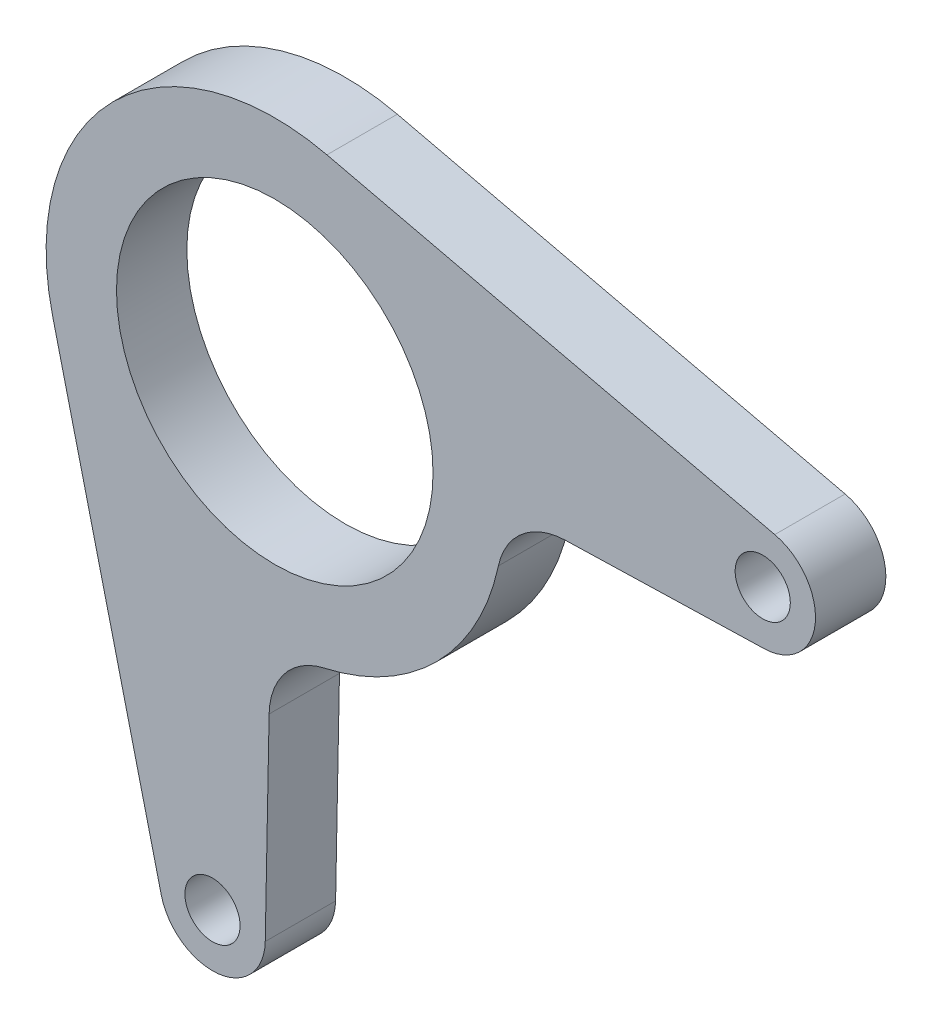
ISO-10303-21;
HEADER;
FILE_DESCRIPTION(('STEP AP214'),'2;1');
FILE_NAME('part.step','',(''),(''),'','','');
FILE_SCHEMA(('AUTOMOTIVE_DESIGN { 1 0 10303 214 1 1 1 1 }'));
ENDSEC;
DATA;
#1=APPLICATION_CONTEXT('core data for automotive mechanical design processes');
#2=APPLICATION_PROTOCOL_DEFINITION('international standard','automotive_design',2000,#1);
#3=PRODUCT_CONTEXT('',#1,'mechanical');
#4=PRODUCT('Part','Part','',(#3));
#5=PRODUCT_RELATED_PRODUCT_CATEGORY('part','',(#4));
#6=PRODUCT_DEFINITION_FORMATION('','',#4);
#7=PRODUCT_DEFINITION_CONTEXT('part definition',#1,'design');
#8=PRODUCT_DEFINITION('design','',#6,#7);
#9=PRODUCT_DEFINITION_SHAPE('','',#8);
#10=(LENGTH_UNIT() NAMED_UNIT(*) SI_UNIT(.MILLI.,.METRE.));
#11=(NAMED_UNIT(*) PLANE_ANGLE_UNIT() SI_UNIT($,.RADIAN.));
#12=(NAMED_UNIT(*) SI_UNIT($,.STERADIAN.) SOLID_ANGLE_UNIT());
#13=UNCERTAINTY_MEASURE_WITH_UNIT(LENGTH_MEASURE(1.E-05),#10,'distance_accuracy_value','');
#14=(GEOMETRIC_REPRESENTATION_CONTEXT(3) GLOBAL_UNCERTAINTY_ASSIGNED_CONTEXT((#13)) GLOBAL_UNIT_ASSIGNED_CONTEXT((#10,
#11,#12)) REPRESENTATION_CONTEXT('',''));
#15=CARTESIAN_POINT('',(0.,0.,0.));
#16=DIRECTION('',(0.,0.,1.));
#17=DIRECTION('',(1.,0.,0.));
#18=AXIS2_PLACEMENT_3D('',#15,#16,#17);
#19=CARTESIAN_POINT('',(654.598852910197,235.857564531037,6.35));
#20=DIRECTION('',(0.,0.,1.));
#21=DIRECTION('',(1.,0.,0.));
#22=AXIS2_PLACEMENT_3D('',#19,#20,#21);
#23=PLANE('',#22);
#24=CARTESIAN_POINT('',(698.644384855137,241.840341117815,6.35));
#25=DIRECTION('',(0.,0.,1.));
#26=DIRECTION('',(1.,0.,0.));
#27=AXIS2_PLACEMENT_3D('',#24,#25,#26);
#28=CIRCLE('',#27,2.48919999999995);
#29=CARTESIAN_POINT('',(701.133584855137,241.840341117815,6.35));
#30=VERTEX_POINT('',#29);
#31=EDGE_CURVE('E376',#30,#30,#28,.T.);
#32=ORIENTED_EDGE('',*,*,#31,.F.);
#33=EDGE_LOOP('',(#32));
#34=FACE_BOUND('',#33,.T.);
#35=DIRECTION('',(0.0194438595660071,0.999810950292693,0.));
#36=VECTOR('',#35,1.);
#37=CARTESIAN_POINT('',(653.739548460031,191.671789788345,6.35));
#38=LINE('',#37,#36);
#39=CARTESIAN_POINT('',(653.739548460031,191.671789788345,6.35));
#40=VERTEX_POINT('',#39);
#41=CARTESIAN_POINT('',(654.088844270555,209.632718536494,6.35));
#42=VERTEX_POINT('',#41);
#43=EDGE_CURVE('E144',#40,#42,#38,.T.);
#44=ORIENTED_EDGE('',*,*,#43,.T.);
#45=CARTESIAN_POINT('',(660.437643804914,209.50925002825,6.35));
#46=DIRECTION('',(0.,0.,1.));
#47=DIRECTION('',(1.,0.,0.));
#48=AXIS2_PLACEMENT_3D('',#45,#46,#47);
#49=CIRCLE('',#48,6.35);
#50=CARTESIAN_POINT('',(659.063810653216,215.708853440671,6.35));
#51=VERTEX_POINT('',#50);
#52=EDGE_CURVE('E187',#42,#51,#49,.F.);
#53=ORIENTED_EDGE('',*,*,#52,.T.);
#54=CARTESIAN_POINT('',(654.598852910197,235.857564531037,6.35));
#55=DIRECTION('',(0.,0.,1.));
#56=DIRECTION('',(1.,0.,0.));
#57=AXIS2_PLACEMENT_3D('',#54,#55,#56);
#58=CIRCLE('',#57,20.6375);
#59=CARTESIAN_POINT('',(674.783547800447,231.558204295197,6.35));
#60=VERTEX_POINT('',#59);
#61=EDGE_CURVE('E118',#51,#60,#58,.T.);
#62=ORIENTED_EDGE('',*,*,#61,.T.);
#63=CARTESIAN_POINT('',(680.994223151293,230.235324222631,6.35));
#64=DIRECTION('',(0.,0.,1.));
#65=DIRECTION('',(1.,0.,0.));
#66=AXIS2_PLACEMENT_3D('',#63,#64,#65);
#67=CIRCLE('',#66,6.35);
#68=CARTESIAN_POINT('',(680.818626949669,236.582895882248,6.35));
#69=VERTEX_POINT('',#68);
#70=EDGE_CURVE('E11',#60,#69,#67,.F.);
#71=ORIENTED_EDGE('',*,*,#70,.T.);
#72=DIRECTION('',(0.999617584191681,0.0276529451376705,0.));
#73=VECTOR('',#72,1.);
#74=CARTESIAN_POINT('',(675.228460803953,236.428252186316,6.35));
#75=LINE('',#74,#73);
#76=CARTESIAN_POINT('',(698.776082006355,237.079662373102,6.35));
#77=VERTEX_POINT('',#76);
#78=EDGE_CURVE('E110',#69,#77,#75,.T.);
#79=ORIENTED_EDGE('',*,*,#78,.T.);
#80=CARTESIAN_POINT('',(698.644384855137,241.840341117815,6.35));
#81=DIRECTION('',(0.,0.,1.));
#82=DIRECTION('',(1.,0.,0.));
#83=AXIS2_PLACEMENT_3D('',#80,#81,#82);
#84=CIRCLE('',#83,4.76249999999997);
#85=CARTESIAN_POINT('',(699.731063713,246.477208089151,6.35));
#86=VERTEX_POINT('',#85);
#87=EDGE_CURVE('E115',#77,#86,#84,.T.);
#88=ORIENTED_EDGE('',*,*,#87,.T.);
#89=DIRECTION('',(-0.973620361435548,0.228174038396382,0.));
#90=VECTOR('',#89,1.);
#91=CARTESIAN_POINT('',(659.307794627603,255.950654740163,6.35));
#92=LINE('',#91,#90);
#93=CARTESIAN_POINT('',(659.307794627603,255.950654740163,6.35));
#94=VERTEX_POINT('',#93);
#95=EDGE_CURVE('E133',#86,#94,#92,.T.);
#96=ORIENTED_EDGE('',*,*,#95,.T.);
#97=CARTESIAN_POINT('',(654.598852910197,235.857564531037,6.35));
#98=DIRECTION('',(0.,0.,1.));
#99=DIRECTION('',(1.,0.,0.));
#100=AXIS2_PLACEMENT_3D('',#97,#98,#99);
#101=CIRCLE('',#100,20.6375);
#102=CARTESIAN_POINT('',(634.545106606393,230.983791307688,6.35));
#103=VERTEX_POINT('',#102);
#104=EDGE_CURVE('E135',#94,#103,#101,.T.);
#105=ORIENTED_EDGE('',*,*,#104,.T.);
#106=DIRECTION('',(0.236161028387608,-0.971713933558075,0.));
#107=VECTOR('',#106,1.);
#108=CARTESIAN_POINT('',(644.350161200691,190.639674271832,6.35));
#109=LINE('',#108,#107);
#110=CARTESIAN_POINT('',(644.350161200691,190.639674271832,6.35));
#111=VERTEX_POINT('',#110);
#112=EDGE_CURVE('E140',#103,#111,#109,.T.);
#113=ORIENTED_EDGE('',*,*,#112,.T.);
#114=CARTESIAN_POINT('',(648.977948809262,191.764391169528,6.35));
#115=DIRECTION('',(0.,0.,1.));
#116=DIRECTION('',(1.,0.,0.));
#117=AXIS2_PLACEMENT_3D('',#114,#115,#116);
#118=CIRCLE('',#117,4.76249999999987);
#119=EDGE_CURVE('E142',#111,#40,#118,.T.);
#120=ORIENTED_EDGE('',*,*,#119,.T.);
#121=EDGE_LOOP('',(#44,#53,#62,#71,#79,#88,#96,#105,#113,#120));
#122=FACE_BOUND('',#121,.T.);
#123=CARTESIAN_POINT('',(654.598852910197,235.857564531037,6.35));
#124=DIRECTION('',(0.,0.,1.));
#125=DIRECTION('',(1.,0.,0.));
#126=AXIS2_PLACEMENT_3D('',#123,#124,#125);
#127=CIRCLE('',#126,14.2875);
#128=CARTESIAN_POINT('',(668.886352910198,235.857564531037,6.35));
#129=VERTEX_POINT('',#128);
#130=EDGE_CURVE('E150',#129,#129,#127,.T.);
#131=ORIENTED_EDGE('',*,*,#130,.F.);
#132=EDGE_LOOP('',(#131));
#133=FACE_BOUND('',#132,.T.);
#134=CARTESIAN_POINT('',(648.977948809262,191.764391169528,6.35));
#135=DIRECTION('',(0.,0.,1.));
#136=DIRECTION('',(1.,0.,0.));
#137=AXIS2_PLACEMENT_3D('',#134,#135,#136);
#138=CIRCLE('',#137,2.48919999999972);
#139=CARTESIAN_POINT('',(651.467148809261,191.764391169528,6.35));
#140=VERTEX_POINT('',#139);
#141=EDGE_CURVE('E367',#140,#140,#138,.T.);
#142=ORIENTED_EDGE('',*,*,#141,.F.);
#143=EDGE_LOOP('',(#142));
#144=FACE_BOUND('',#143,.T.);
#145=ADVANCED_FACE('F37',(#34,#122,#133,#144),#23,.T.);
#146=CARTESIAN_POINT('',(654.598852910197,235.857564531037,0.));
#147=DIRECTION('',(0.,0.,1.));
#148=DIRECTION('',(1.,0.,0.));
#149=AXIS2_PLACEMENT_3D('',#146,#147,#148);
#150=PLANE('',#149);
#151=CARTESIAN_POINT('',(654.598852910197,235.857564531037,0.));
#152=DIRECTION('',(0.,0.,1.));
#153=DIRECTION('',(1.,0.,0.));
#154=AXIS2_PLACEMENT_3D('',#151,#152,#153);
#155=CIRCLE('',#154,20.6375);
#156=CARTESIAN_POINT('',(659.063810653216,215.708853440671,0.));
#157=VERTEX_POINT('',#156);
#158=CARTESIAN_POINT('',(674.783547800447,231.558204295197,0.));
#159=VERTEX_POINT('',#158);
#160=EDGE_CURVE('E147',#157,#159,#155,.T.);
#161=ORIENTED_EDGE('',*,*,#160,.F.);
#162=CARTESIAN_POINT('',(660.437643804914,209.50925002825,0.));
#163=DIRECTION('',(0.,0.,1.));
#164=DIRECTION('',(1.,0.,0.));
#165=AXIS2_PLACEMENT_3D('',#162,#163,#164);
#166=CIRCLE('',#165,6.35);
#167=CARTESIAN_POINT('',(654.088844270555,209.632718536494,0.));
#168=VERTEX_POINT('',#167);
#169=EDGE_CURVE('E185',#157,#168,#166,.T.);
#170=ORIENTED_EDGE('',*,*,#169,.T.);
#171=DIRECTION('',(0.0194438595660071,0.999810950292693,0.));
#172=VECTOR('',#171,1.);
#173=CARTESIAN_POINT('',(653.739548460031,191.671789788345,0.));
#174=LINE('',#173,#172);
#175=CARTESIAN_POINT('',(653.739548460031,191.671789788345,0.));
#176=VERTEX_POINT('',#175);
#177=EDGE_CURVE('E162',#176,#168,#174,.T.);
#178=ORIENTED_EDGE('',*,*,#177,.F.);
#179=CARTESIAN_POINT('',(648.977948809262,191.764391169528,0.));
#180=DIRECTION('',(0.,0.,1.));
#181=DIRECTION('',(1.,0.,0.));
#182=AXIS2_PLACEMENT_3D('',#179,#180,#181);
#183=CIRCLE('',#182,4.76249999999987);
#184=CARTESIAN_POINT('',(644.350161200691,190.639674271832,0.));
#185=VERTEX_POINT('',#184);
#186=EDGE_CURVE('E160',#185,#176,#183,.T.);
#187=ORIENTED_EDGE('',*,*,#186,.F.);
#188=DIRECTION('',(0.236161028387608,-0.971713933558075,0.));
#189=VECTOR('',#188,1.);
#190=CARTESIAN_POINT('',(644.350161200691,190.639674271832,0.));
#191=LINE('',#190,#189);
#192=CARTESIAN_POINT('',(634.545106606393,230.983791307688,0.));
#193=VERTEX_POINT('',#192);
#194=EDGE_CURVE('E158',#193,#185,#191,.T.);
#195=ORIENTED_EDGE('',*,*,#194,.F.);
#196=CARTESIAN_POINT('',(654.598852910197,235.857564531037,0.));
#197=DIRECTION('',(0.,0.,1.));
#198=DIRECTION('',(1.,0.,0.));
#199=AXIS2_PLACEMENT_3D('',#196,#197,#198);
#200=CIRCLE('',#199,20.6375);
#201=CARTESIAN_POINT('',(659.307794627603,255.950654740163,0.));
#202=VERTEX_POINT('',#201);
#203=EDGE_CURVE('E156',#202,#193,#200,.T.);
#204=ORIENTED_EDGE('',*,*,#203,.F.);
#205=DIRECTION('',(-0.973620361435548,0.228174038396382,0.));
#206=VECTOR('',#205,1.);
#207=CARTESIAN_POINT('',(659.307794627603,255.950654740163,0.));
#208=LINE('',#207,#206);
#209=CARTESIAN_POINT('',(699.731063713,246.477208089151,0.));
#210=VERTEX_POINT('',#209);
#211=EDGE_CURVE('E154',#210,#202,#208,.T.);
#212=ORIENTED_EDGE('',*,*,#211,.F.);
#213=CARTESIAN_POINT('',(698.644384855137,241.840341117815,0.));
#214=DIRECTION('',(0.,0.,1.));
#215=DIRECTION('',(1.,0.,0.));
#216=AXIS2_PLACEMENT_3D('',#213,#214,#215);
#217=CIRCLE('',#216,4.76249999999997);
#218=CARTESIAN_POINT('',(698.776082006355,237.079662373102,0.));
#219=VERTEX_POINT('',#218);
#220=EDGE_CURVE('E152',#219,#210,#217,.T.);
#221=ORIENTED_EDGE('',*,*,#220,.F.);
#222=DIRECTION('',(0.999617584191681,0.0276529451376705,0.));
#223=VECTOR('',#222,1.);
#224=CARTESIAN_POINT('',(675.228460803953,236.428252186316,0.));
#225=LINE('',#224,#223);
#226=CARTESIAN_POINT('',(680.818626949669,236.582895882248,0.));
#227=VERTEX_POINT('',#226);
#228=EDGE_CURVE('E124',#227,#219,#225,.T.);
#229=ORIENTED_EDGE('',*,*,#228,.F.);
#230=CARTESIAN_POINT('',(680.994223151293,230.235324222631,0.));
#231=DIRECTION('',(0.,0.,1.));
#232=DIRECTION('',(1.,0.,0.));
#233=AXIS2_PLACEMENT_3D('',#230,#231,#232);
#234=CIRCLE('',#233,6.35);
#235=EDGE_CURVE('E45',#227,#159,#234,.T.);
#236=ORIENTED_EDGE('',*,*,#235,.T.);
#237=EDGE_LOOP('',(#161,#170,#178,#187,#195,#204,#212,#221,#229,#236));
#238=FACE_BOUND('',#237,.T.);
#239=CARTESIAN_POINT('',(654.598852910197,235.857564531037,0.));
#240=DIRECTION('',(0.,0.,1.));
#241=DIRECTION('',(1.,0.,0.));
#242=AXIS2_PLACEMENT_3D('',#239,#240,#241);
#243=CIRCLE('',#242,14.2875);
#244=CARTESIAN_POINT('',(668.886352910198,235.857564531037,0.));
#245=VERTEX_POINT('',#244);
#246=EDGE_CURVE('E379',#245,#245,#243,.T.);
#247=ORIENTED_EDGE('',*,*,#246,.T.);
#248=EDGE_LOOP('',(#247));
#249=FACE_BOUND('',#248,.T.);
#250=CARTESIAN_POINT('',(698.644384855137,241.840341117815,0.));
#251=DIRECTION('',(0.,0.,1.));
#252=DIRECTION('',(1.,0.,0.));
#253=AXIS2_PLACEMENT_3D('',#250,#251,#252);
#254=CIRCLE('',#253,2.48919999999995);
#255=CARTESIAN_POINT('',(701.133584855137,241.840341117815,0.));
#256=VERTEX_POINT('',#255);
#257=EDGE_CURVE('E373',#256,#256,#254,.T.);
#258=ORIENTED_EDGE('',*,*,#257,.T.);
#259=EDGE_LOOP('',(#258));
#260=FACE_BOUND('',#259,.T.);
#261=CARTESIAN_POINT('',(648.977948809262,191.764391169528,0.));
#262=DIRECTION('',(0.,0.,1.));
#263=DIRECTION('',(1.,0.,0.));
#264=AXIS2_PLACEMENT_3D('',#261,#262,#263);
#265=CIRCLE('',#264,2.48919999999972);
#266=CARTESIAN_POINT('',(651.467148809261,191.764391169528,0.));
#267=VERTEX_POINT('',#266);
#268=EDGE_CURVE('E370',#267,#267,#265,.T.);
#269=ORIENTED_EDGE('',*,*,#268,.T.);
#270=EDGE_LOOP('',(#269));
#271=FACE_BOUND('',#270,.T.);
#272=ADVANCED_FACE('F190',(#238,#249,#260,#271),#150,.F.);
#273=CARTESIAN_POINT('',(654.598852910197,235.857564531037,6.35));
#274=DIRECTION('',(0.,0.,-1.));
#275=DIRECTION('',(-1.,0.,0.));
#276=AXIS2_PLACEMENT_3D('',#273,#274,#275);
#277=CYLINDRICAL_SURFACE('',#276,20.6375);
#278=ORIENTED_EDGE('',*,*,#61,.F.);
#279=DIRECTION('',(0.,0.,-1.));
#280=VECTOR('',#279,1.);
#281=CARTESIAN_POINT('',(659.063810653216,215.708853440671,6.35));
#282=LINE('',#281,#280);
#283=EDGE_CURVE('E178',#51,#157,#282,.T.);
#284=ORIENTED_EDGE('',*,*,#283,.T.);
#285=ORIENTED_EDGE('',*,*,#160,.T.);
#286=DIRECTION('',(0.,0.,-1.));
#287=VECTOR('',#286,1.);
#288=CARTESIAN_POINT('',(674.783547800447,231.558204295197,6.35));
#289=LINE('',#288,#287);
#290=EDGE_CURVE('E127',#159,#60,#289,.F.);
#291=ORIENTED_EDGE('',*,*,#290,.T.);
#292=EDGE_LOOP('',(#278,#284,#285,#291));
#293=FACE_BOUND('',#292,.T.);
#294=ADVANCED_FACE('F194',(#293),#277,.T.);
#295=CARTESIAN_POINT('',(675.228460803953,236.428252186316,6.35));
#296=DIRECTION('',(-0.0276529451376705,0.999617584191681,0.));
#297=DIRECTION('',(-0.999617584191681,-0.0276529451376705,0.));
#298=AXIS2_PLACEMENT_3D('',#295,#296,#297);
#299=PLANE('',#298);
#300=ORIENTED_EDGE('',*,*,#78,.F.);
#301=DIRECTION('',(0.,0.,1.));
#302=VECTOR('',#301,1.);
#303=CARTESIAN_POINT('',(680.818626949669,236.582895882248,0.));
#304=LINE('',#303,#302);
#305=EDGE_CURVE('E183',#69,#227,#304,.F.);
#306=ORIENTED_EDGE('',*,*,#305,.T.);
#307=ORIENTED_EDGE('',*,*,#228,.T.);
#308=DIRECTION('',(0.,0.,-1.));
#309=VECTOR('',#308,1.);
#310=CARTESIAN_POINT('',(698.776082006355,237.079662373102,6.35));
#311=LINE('',#310,#309);
#312=EDGE_CURVE('E121',#77,#219,#311,.T.);
#313=ORIENTED_EDGE('',*,*,#312,.F.);
#314=EDGE_LOOP('',(#300,#306,#307,#313));
#315=FACE_BOUND('',#314,.T.);
#316=ADVANCED_FACE('F122',(#315),#299,.F.);
#317=CARTESIAN_POINT('',(698.644384855137,241.840341117815,6.35));
#318=DIRECTION('',(0.,0.,-1.));
#319=DIRECTION('',(-1.,0.,0.));
#320=AXIS2_PLACEMENT_3D('',#317,#318,#319);
#321=CYLINDRICAL_SURFACE('',#320,4.76249999999997);
#322=ORIENTED_EDGE('',*,*,#220,.T.);
#323=DIRECTION('',(0.,0.,-1.));
#324=VECTOR('',#323,1.);
#325=CARTESIAN_POINT('',(699.731063713,246.477208089151,6.35));
#326=LINE('',#325,#324);
#327=EDGE_CURVE('E128',#86,#210,#326,.T.);
#328=ORIENTED_EDGE('',*,*,#327,.F.);
#329=ORIENTED_EDGE('',*,*,#87,.F.);
#330=ORIENTED_EDGE('',*,*,#312,.T.);
#331=EDGE_LOOP('',(#322,#328,#329,#330));
#332=FACE_BOUND('',#331,.T.);
#333=ADVANCED_FACE('F130',(#332),#321,.T.);
#334=CARTESIAN_POINT('',(659.307794627603,255.950654740163,6.35));
#335=DIRECTION('',(-0.228174038396382,-0.973620361435548,0.));
#336=DIRECTION('',(0.973620361435548,-0.228174038396382,0.));
#337=AXIS2_PLACEMENT_3D('',#334,#335,#336);
#338=PLANE('',#337);
#339=ORIENTED_EDGE('',*,*,#211,.T.);
#340=DIRECTION('',(0.,0.,-1.));
#341=VECTOR('',#340,1.);
#342=CARTESIAN_POINT('',(659.307794627603,255.950654740163,6.35));
#343=LINE('',#342,#341);
#344=EDGE_CURVE('E173',#94,#202,#343,.T.);
#345=ORIENTED_EDGE('',*,*,#344,.F.);
#346=ORIENTED_EDGE('',*,*,#95,.F.);
#347=ORIENTED_EDGE('',*,*,#327,.T.);
#348=EDGE_LOOP('',(#339,#345,#346,#347));
#349=FACE_BOUND('',#348,.T.);
#350=ADVANCED_FACE('F230',(#349),#338,.F.);
#351=CARTESIAN_POINT('',(654.598852910197,235.857564531037,6.35));
#352=DIRECTION('',(0.,0.,-1.));
#353=DIRECTION('',(-1.,0.,0.));
#354=AXIS2_PLACEMENT_3D('',#351,#352,#353);
#355=CYLINDRICAL_SURFACE('',#354,20.6375);
#356=ORIENTED_EDGE('',*,*,#203,.T.);
#357=DIRECTION('',(0.,0.,-1.));
#358=VECTOR('',#357,1.);
#359=CARTESIAN_POINT('',(634.545106606393,230.983791307688,6.35));
#360=LINE('',#359,#358);
#361=EDGE_CURVE('E170',#103,#193,#360,.T.);
#362=ORIENTED_EDGE('',*,*,#361,.F.);
#363=ORIENTED_EDGE('',*,*,#104,.F.);
#364=ORIENTED_EDGE('',*,*,#344,.T.);
#365=EDGE_LOOP('',(#356,#362,#363,#364));
#366=FACE_BOUND('',#365,.T.);
#367=ADVANCED_FACE('F226',(#366),#355,.T.);
#368=CARTESIAN_POINT('',(644.350161200691,190.639674271832,6.35));
#369=DIRECTION('',(0.971713933558075,0.236161028387608,0.));
#370=DIRECTION('',(-0.236161028387608,0.971713933558075,0.));
#371=AXIS2_PLACEMENT_3D('',#368,#369,#370);
#372=PLANE('',#371);
#373=ORIENTED_EDGE('',*,*,#194,.T.);
#374=DIRECTION('',(0.,0.,-1.));
#375=VECTOR('',#374,1.);
#376=CARTESIAN_POINT('',(644.350161200691,190.639674271832,6.35));
#377=LINE('',#376,#375);
#378=EDGE_CURVE('E167',#111,#185,#377,.T.);
#379=ORIENTED_EDGE('',*,*,#378,.F.);
#380=ORIENTED_EDGE('',*,*,#112,.F.);
#381=ORIENTED_EDGE('',*,*,#361,.T.);
#382=EDGE_LOOP('',(#373,#379,#380,#381));
#383=FACE_BOUND('',#382,.T.);
#384=ADVANCED_FACE('F222',(#383),#372,.F.);
#385=CARTESIAN_POINT('',(648.977948809262,191.764391169528,6.35));
#386=DIRECTION('',(0.,0.,-1.));
#387=DIRECTION('',(-1.,0.,0.));
#388=AXIS2_PLACEMENT_3D('',#385,#386,#387);
#389=CYLINDRICAL_SURFACE('',#388,4.76249999999987);
#390=ORIENTED_EDGE('',*,*,#186,.T.);
#391=DIRECTION('',(0.,0.,-1.));
#392=VECTOR('',#391,1.);
#393=CARTESIAN_POINT('',(653.739548460031,191.671789788345,6.35));
#394=LINE('',#393,#392);
#395=EDGE_CURVE('E146',#40,#176,#394,.T.);
#396=ORIENTED_EDGE('',*,*,#395,.F.);
#397=ORIENTED_EDGE('',*,*,#119,.F.);
#398=ORIENTED_EDGE('',*,*,#378,.T.);
#399=EDGE_LOOP('',(#390,#396,#397,#398));
#400=FACE_BOUND('',#399,.T.);
#401=ADVANCED_FACE('F218',(#400),#389,.T.);
#402=CARTESIAN_POINT('',(653.739548460031,191.671789788345,6.35));
#403=DIRECTION('',(-0.999810950292693,0.0194438595660071,0.));
#404=DIRECTION('',(-0.0194438595660071,-0.999810950292693,0.));
#405=AXIS2_PLACEMENT_3D('',#402,#403,#404);
#406=PLANE('',#405);
#407=ORIENTED_EDGE('',*,*,#177,.T.);
#408=DIRECTION('',(0.,0.,1.));
#409=VECTOR('',#408,1.);
#410=CARTESIAN_POINT('',(654.088844270555,209.632718536494,6.35));
#411=LINE('',#410,#409);
#412=EDGE_CURVE('E181',#168,#42,#411,.T.);
#413=ORIENTED_EDGE('',*,*,#412,.T.);
#414=ORIENTED_EDGE('',*,*,#43,.F.);
#415=ORIENTED_EDGE('',*,*,#395,.T.);
#416=EDGE_LOOP('',(#407,#413,#414,#415));
#417=FACE_BOUND('',#416,.T.);
#418=ADVANCED_FACE('F215',(#417),#406,.F.);
#419=CARTESIAN_POINT('',(654.598852910197,235.857564531037,6.35));
#420=DIRECTION('',(0.,0.,-1.));
#421=DIRECTION('',(-1.,0.,0.));
#422=AXIS2_PLACEMENT_3D('',#419,#420,#421);
#423=CYLINDRICAL_SURFACE('',#422,14.2875);
#424=ORIENTED_EDGE('',*,*,#130,.T.);
#425=EDGE_LOOP('',(#424));
#426=FACE_BOUND('',#425,.T.);
#427=ORIENTED_EDGE('',*,*,#246,.F.);
#428=EDGE_LOOP('',(#427));
#429=FACE_BOUND('',#428,.T.);
#430=ADVANCED_FACE('F212',(#426,#429),#423,.F.);
#431=CARTESIAN_POINT('',(698.644384855137,241.840341117815,6.35));
#432=DIRECTION('',(0.,0.,-1.));
#433=DIRECTION('',(-1.,0.,0.));
#434=AXIS2_PLACEMENT_3D('',#431,#432,#433);
#435=CYLINDRICAL_SURFACE('',#434,2.48919999999995);
#436=ORIENTED_EDGE('',*,*,#31,.T.);
#437=EDGE_LOOP('',(#436));
#438=FACE_BOUND('',#437,.T.);
#439=ORIENTED_EDGE('',*,*,#257,.F.);
#440=EDGE_LOOP('',(#439));
#441=FACE_BOUND('',#440,.T.);
#442=ADVANCED_FACE('F279',(#438,#441),#435,.F.);
#443=CARTESIAN_POINT('',(648.977948809262,191.764391169528,6.35));
#444=DIRECTION('',(0.,0.,-1.));
#445=DIRECTION('',(-1.,0.,0.));
#446=AXIS2_PLACEMENT_3D('',#443,#444,#445);
#447=CYLINDRICAL_SURFACE('',#446,2.48919999999972);
#448=ORIENTED_EDGE('',*,*,#141,.T.);
#449=EDGE_LOOP('',(#448));
#450=FACE_BOUND('',#449,.T.);
#451=ORIENTED_EDGE('',*,*,#268,.F.);
#452=EDGE_LOOP('',(#451));
#453=FACE_BOUND('',#452,.T.);
#454=ADVANCED_FACE('F201',(#450,#453),#447,.F.);
#455=CARTESIAN_POINT('',(660.437643804914,209.50925002825,6.35));
#456=DIRECTION('',(0.,0.,-1.));
#457=DIRECTION('',(-1.,0.,0.));
#458=AXIS2_PLACEMENT_3D('',#455,#456,#457);
#459=CYLINDRICAL_SURFACE('',#458,6.35);
#460=ORIENTED_EDGE('',*,*,#52,.F.);
#461=ORIENTED_EDGE('',*,*,#412,.F.);
#462=ORIENTED_EDGE('',*,*,#169,.F.);
#463=ORIENTED_EDGE('',*,*,#283,.F.);
#464=EDGE_LOOP('',(#460,#461,#462,#463));
#465=FACE_BOUND('',#464,.T.);
#466=ADVANCED_FACE('F197',(#465),#459,.F.);
#467=CARTESIAN_POINT('',(680.994223151293,230.235324222631,6.35));
#468=DIRECTION('',(0.,0.,-1.));
#469=DIRECTION('',(-1.,0.,0.));
#470=AXIS2_PLACEMENT_3D('',#467,#468,#469);
#471=CYLINDRICAL_SURFACE('',#470,6.35);
#472=ORIENTED_EDGE('',*,*,#70,.F.);
#473=ORIENTED_EDGE('',*,*,#290,.F.);
#474=ORIENTED_EDGE('',*,*,#235,.F.);
#475=ORIENTED_EDGE('',*,*,#305,.F.);
#476=EDGE_LOOP('',(#472,#473,#474,#475));
#477=FACE_BOUND('',#476,.T.);
#478=ADVANCED_FACE('F39',(#477),#471,.F.);
#479=CLOSED_SHELL('',(#145,#272,#294,#316,#333,#350,#367,#384,#401,#418,#430,#442,#454,#466,#478));
#480=MANIFOLD_SOLID_BREP('B2',#479);
#481=ADVANCED_BREP_SHAPE_REPRESENTATION('',(#18,#480),#14);
#482=SHAPE_DEFINITION_REPRESENTATION(#9,#481);
ENDSEC;
END-ISO-10303-21;
